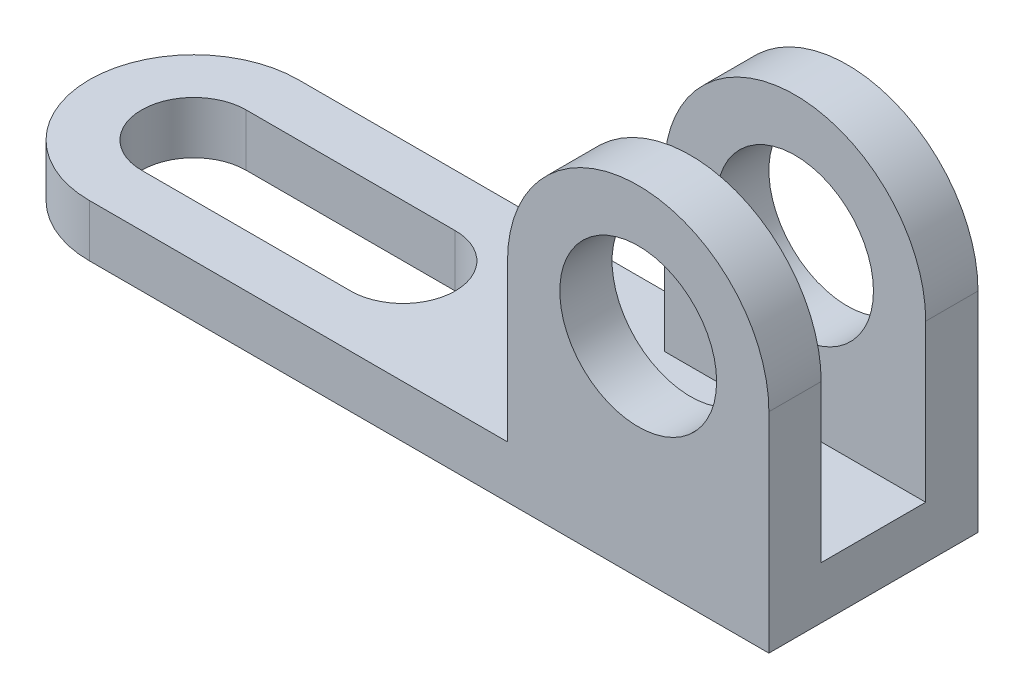
ISO-10303-21;
HEADER;
FILE_DESCRIPTION(('STEP AP214'),'2;1');
FILE_NAME('part.step','',(''),(''),'','','');
FILE_SCHEMA(('AUTOMOTIVE_DESIGN { 1 0 10303 214 1 1 1 1 }'));
ENDSEC;
DATA;
#1=APPLICATION_CONTEXT('core data for automotive mechanical design processes');
#2=APPLICATION_PROTOCOL_DEFINITION('international standard','automotive_design',2000,#1);
#3=PRODUCT_CONTEXT('',#1,'mechanical');
#4=PRODUCT('Part','Part','',(#3));
#5=PRODUCT_RELATED_PRODUCT_CATEGORY('part','',(#4));
#6=PRODUCT_DEFINITION_FORMATION('','',#4);
#7=PRODUCT_DEFINITION_CONTEXT('part definition',#1,'design');
#8=PRODUCT_DEFINITION('design','',#6,#7);
#9=PRODUCT_DEFINITION_SHAPE('','',#8);
#10=(LENGTH_UNIT() NAMED_UNIT(*) SI_UNIT(.MILLI.,.METRE.));
#11=(NAMED_UNIT(*) PLANE_ANGLE_UNIT() SI_UNIT($,.RADIAN.));
#12=(NAMED_UNIT(*) SI_UNIT($,.STERADIAN.) SOLID_ANGLE_UNIT());
#13=UNCERTAINTY_MEASURE_WITH_UNIT(LENGTH_MEASURE(1.E-05),#10,'distance_accuracy_value','');
#14=(GEOMETRIC_REPRESENTATION_CONTEXT(3) GLOBAL_UNCERTAINTY_ASSIGNED_CONTEXT((#13)) GLOBAL_UNIT_ASSIGNED_CONTEXT((#10,
#11,#12)) REPRESENTATION_CONTEXT('',''));
#15=CARTESIAN_POINT('',(0.,0.,0.));
#16=DIRECTION('',(0.,0.,1.));
#17=DIRECTION('',(1.,0.,0.));
#18=AXIS2_PLACEMENT_3D('',#15,#16,#17);
#19=CARTESIAN_POINT('',(-65.,5.,0.));
#20=DIRECTION('',(0.,1.,0.));
#21=DIRECTION('',(0.,0.,1.));
#22=AXIS2_PLACEMENT_3D('',#19,#20,#21);
#23=PLANE('',#22);
#24=DIRECTION('',(1.,0.,0.));
#25=VECTOR('',#24,1.);
#26=CARTESIAN_POINT('',(-65.,5.,10.));
#27=LINE('',#26,#25);
#28=CARTESIAN_POINT('',(-65.,5.,10.));
#29=VERTEX_POINT('',#28);
#30=CARTESIAN_POINT('',(-25.,5.,10.));
#31=VERTEX_POINT('',#30);
#32=EDGE_CURVE('E204',#29,#31,#27,.T.);
#33=ORIENTED_EDGE('',*,*,#32,.F.);
#34=CARTESIAN_POINT('',(-65.,5.,0.));
#35=DIRECTION('',(0.,1.,0.));
#36=DIRECTION('',(0.,0.,1.));
#37=AXIS2_PLACEMENT_3D('',#34,#35,#36);
#38=CIRCLE('',#37,10.);
#39=CARTESIAN_POINT('',(-65.,5.,-10.));
#40=VERTEX_POINT('',#39);
#41=EDGE_CURVE('E202',#40,#29,#38,.T.);
#42=ORIENTED_EDGE('',*,*,#41,.F.);
#43=DIRECTION('',(-1.,0.,0.));
#44=VECTOR('',#43,1.);
#45=CARTESIAN_POINT('',(-65.,5.,-10.));
#46=LINE('',#45,#44);
#47=CARTESIAN_POINT('',(-25.,5.,-10.));
#48=VERTEX_POINT('',#47);
#49=EDGE_CURVE('E210',#48,#40,#46,.T.);
#50=ORIENTED_EDGE('',*,*,#49,.F.);
#51=CARTESIAN_POINT('',(-25.,5.,0.));
#52=DIRECTION('',(0.,1.,0.));
#53=DIRECTION('',(0.,0.,1.));
#54=AXIS2_PLACEMENT_3D('',#51,#52,#53);
#55=CIRCLE('',#54,10.);
#56=EDGE_CURVE('E207',#31,#48,#55,.T.);
#57=ORIENTED_EDGE('',*,*,#56,.F.);
#58=EDGE_LOOP('',(#33,#42,#50,#57));
#59=FACE_BOUND('',#58,.T.);
#60=DIRECTION('',(0.,0.,-1.));
#61=VECTOR('',#60,1.);
#62=CARTESIAN_POINT('',(65.,5.,20.));
#63=LINE('',#62,#61);
#64=CARTESIAN_POINT('',(65.,5.,10.));
#65=VERTEX_POINT('',#64);
#66=CARTESIAN_POINT('',(65.,5.,-10.));
#67=VERTEX_POINT('',#66);
#68=EDGE_CURVE('E57',#65,#67,#63,.T.);
#69=ORIENTED_EDGE('',*,*,#68,.T.);
#70=DIRECTION('',(1.,0.,0.));
#71=VECTOR('',#70,1.);
#72=CARTESIAN_POINT('',(65.,5.,-10.));
#73=LINE('',#72,#71);
#74=CARTESIAN_POINT('',(15.,5.,-10.));
#75=VERTEX_POINT('',#74);
#76=EDGE_CURVE('E52',#75,#67,#73,.T.);
#77=ORIENTED_EDGE('',*,*,#76,.F.);
#78=DIRECTION('',(0.,0.,-1.));
#79=VECTOR('',#78,1.);
#80=CARTESIAN_POINT('',(15.,4.99999999999999,-10.));
#81=LINE('',#80,#79);
#82=CARTESIAN_POINT('',(15.,4.99999999999999,-20.));
#83=VERTEX_POINT('',#82);
#84=EDGE_CURVE('E149',#75,#83,#81,.T.);
#85=ORIENTED_EDGE('',*,*,#84,.T.);
#86=DIRECTION('',(-1.,0.,0.));
#87=VECTOR('',#86,1.);
#88=CARTESIAN_POINT('',(65.,5.,-20.));
#89=LINE('',#88,#87);
#90=CARTESIAN_POINT('',(-65.,5.,-20.));
#91=VERTEX_POINT('',#90);
#92=EDGE_CURVE('E241',#83,#91,#89,.T.);
#93=ORIENTED_EDGE('',*,*,#92,.T.);
#94=CARTESIAN_POINT('',(-65.,5.,0.));
#95=DIRECTION('',(0.,1.,0.));
#96=DIRECTION('',(0.,0.,1.));
#97=AXIS2_PLACEMENT_3D('',#94,#95,#96);
#98=CIRCLE('',#97,20.);
#99=CARTESIAN_POINT('',(-65.,5.,20.));
#100=VERTEX_POINT('',#99);
#101=EDGE_CURVE('E233',#91,#100,#98,.T.);
#102=ORIENTED_EDGE('',*,*,#101,.T.);
#103=DIRECTION('',(1.,0.,0.));
#104=VECTOR('',#103,1.);
#105=CARTESIAN_POINT('',(65.,5.,20.));
#106=LINE('',#105,#104);
#107=CARTESIAN_POINT('',(15.,4.99999999999999,20.));
#108=VERTEX_POINT('',#107);
#109=EDGE_CURVE('E236',#100,#108,#106,.T.);
#110=ORIENTED_EDGE('',*,*,#109,.T.);
#111=DIRECTION('',(0.,0.,1.));
#112=VECTOR('',#111,1.);
#113=CARTESIAN_POINT('',(15.,4.99999999999999,10.));
#114=LINE('',#113,#112);
#115=CARTESIAN_POINT('',(15.,4.99999999999999,10.));
#116=VERTEX_POINT('',#115);
#117=EDGE_CURVE('E195',#116,#108,#114,.T.);
#118=ORIENTED_EDGE('',*,*,#117,.F.);
#119=DIRECTION('',(1.,0.,0.));
#120=VECTOR('',#119,1.);
#121=CARTESIAN_POINT('',(65.,5.,10.));
#122=LINE('',#121,#120);
#123=EDGE_CURVE('E188',#116,#65,#122,.T.);
#124=ORIENTED_EDGE('',*,*,#123,.T.);
#125=EDGE_LOOP('',(#69,#77,#85,#93,#102,#110,#118,#124));
#126=FACE_BOUND('',#125,.T.);
#127=ADVANCED_FACE('F37',(#59,#126),#23,.T.);
#128=CARTESIAN_POINT('',(-65.,-5.,0.));
#129=DIRECTION('',(0.,1.,0.));
#130=DIRECTION('',(0.,0.,1.));
#131=AXIS2_PLACEMENT_3D('',#128,#129,#130);
#132=PLANE('',#131);
#133=CARTESIAN_POINT('',(-65.,-5.,0.));
#134=DIRECTION('',(0.,1.,0.));
#135=DIRECTION('',(0.,0.,1.));
#136=AXIS2_PLACEMENT_3D('',#133,#134,#135);
#137=CIRCLE('',#136,20.);
#138=CARTESIAN_POINT('',(-65.,-5.,-20.));
#139=VERTEX_POINT('',#138);
#140=CARTESIAN_POINT('',(-65.,-5.,20.));
#141=VERTEX_POINT('',#140);
#142=EDGE_CURVE('E232',#139,#141,#137,.T.);
#143=ORIENTED_EDGE('',*,*,#142,.F.);
#144=DIRECTION('',(-1.,0.,0.));
#145=VECTOR('',#144,1.);
#146=CARTESIAN_POINT('',(65.,-5.,-20.));
#147=LINE('',#146,#145);
#148=CARTESIAN_POINT('',(65.,-5.,-20.));
#149=VERTEX_POINT('',#148);
#150=EDGE_CURVE('E237',#149,#139,#147,.T.);
#151=ORIENTED_EDGE('',*,*,#150,.F.);
#152=DIRECTION('',(0.,0.,-1.));
#153=VECTOR('',#152,1.);
#154=CARTESIAN_POINT('',(65.,-5.,20.));
#155=LINE('',#154,#153);
#156=CARTESIAN_POINT('',(65.,-5.,20.));
#157=VERTEX_POINT('',#156);
#158=EDGE_CURVE('E249',#157,#149,#155,.T.);
#159=ORIENTED_EDGE('',*,*,#158,.F.);
#160=DIRECTION('',(1.,0.,0.));
#161=VECTOR('',#160,1.);
#162=CARTESIAN_POINT('',(65.,-5.,20.));
#163=LINE('',#162,#161);
#164=EDGE_CURVE('E246',#141,#157,#163,.T.);
#165=ORIENTED_EDGE('',*,*,#164,.F.);
#166=EDGE_LOOP('',(#143,#151,#159,#165));
#167=FACE_BOUND('',#166,.T.);
#168=CARTESIAN_POINT('',(-65.,-5.,0.));
#169=DIRECTION('',(0.,1.,0.));
#170=DIRECTION('',(0.,0.,1.));
#171=AXIS2_PLACEMENT_3D('',#168,#169,#170);
#172=CIRCLE('',#171,10.);
#173=CARTESIAN_POINT('',(-65.,-5.,-10.));
#174=VERTEX_POINT('',#173);
#175=CARTESIAN_POINT('',(-65.,-5.,10.));
#176=VERTEX_POINT('',#175);
#177=EDGE_CURVE('E197',#174,#176,#172,.T.);
#178=ORIENTED_EDGE('',*,*,#177,.T.);
#179=DIRECTION('',(1.,0.,0.));
#180=VECTOR('',#179,1.);
#181=CARTESIAN_POINT('',(-65.,-5.,10.));
#182=LINE('',#181,#180);
#183=CARTESIAN_POINT('',(-25.,-5.,10.));
#184=VERTEX_POINT('',#183);
#185=EDGE_CURVE('E215',#176,#184,#182,.T.);
#186=ORIENTED_EDGE('',*,*,#185,.T.);
#187=CARTESIAN_POINT('',(-25.,-5.,0.));
#188=DIRECTION('',(0.,1.,0.));
#189=DIRECTION('',(0.,0.,1.));
#190=AXIS2_PLACEMENT_3D('',#187,#188,#189);
#191=CIRCLE('',#190,10.);
#192=CARTESIAN_POINT('',(-25.,-5.,-10.));
#193=VERTEX_POINT('',#192);
#194=EDGE_CURVE('E218',#184,#193,#191,.T.);
#195=ORIENTED_EDGE('',*,*,#194,.T.);
#196=DIRECTION('',(-1.,0.,0.));
#197=VECTOR('',#196,1.);
#198=CARTESIAN_POINT('',(-65.,-5.,-10.));
#199=LINE('',#198,#197);
#200=EDGE_CURVE('E205',#193,#174,#199,.T.);
#201=ORIENTED_EDGE('',*,*,#200,.T.);
#202=EDGE_LOOP('',(#178,#186,#195,#201));
#203=FACE_BOUND('',#202,.T.);
#204=ADVANCED_FACE('F267',(#167,#203),#132,.F.);
#205=CARTESIAN_POINT('',(-65.,5.,0.));
#206=DIRECTION('',(0.,-1.,0.));
#207=DIRECTION('',(0.,0.,-1.));
#208=AXIS2_PLACEMENT_3D('',#205,#206,#207);
#209=CYLINDRICAL_SURFACE('',#208,20.);
#210=ORIENTED_EDGE('',*,*,#142,.T.);
#211=DIRECTION('',(0.,-1.,0.));
#212=VECTOR('',#211,1.);
#213=CARTESIAN_POINT('',(-65.,5.,20.));
#214=LINE('',#213,#212);
#215=EDGE_CURVE('E11',#100,#141,#214,.T.);
#216=ORIENTED_EDGE('',*,*,#215,.F.);
#217=ORIENTED_EDGE('',*,*,#101,.F.);
#218=DIRECTION('',(0.,-1.,0.));
#219=VECTOR('',#218,1.);
#220=CARTESIAN_POINT('',(-65.,5.,-20.));
#221=LINE('',#220,#219);
#222=EDGE_CURVE('E243',#91,#139,#221,.T.);
#223=ORIENTED_EDGE('',*,*,#222,.T.);
#224=EDGE_LOOP('',(#210,#216,#217,#223));
#225=FACE_BOUND('',#224,.T.);
#226=ADVANCED_FACE('F39',(#225),#209,.T.);
#227=CARTESIAN_POINT('',(65.,5.,20.));
#228=DIRECTION('',(0.,0.,-1.));
#229=DIRECTION('',(-1.,0.,0.));
#230=AXIS2_PLACEMENT_3D('',#227,#228,#229);
#231=PLANE('',#230);
#232=DIRECTION('',(0.,-1.,0.));
#233=VECTOR('',#232,1.);
#234=CARTESIAN_POINT('',(15.,4.99999999999999,20.));
#235=LINE('',#234,#233);
#236=CARTESIAN_POINT('',(15.,35.,20.));
#237=VERTEX_POINT('',#236);
#238=EDGE_CURVE('E183',#237,#108,#235,.T.);
#239=ORIENTED_EDGE('',*,*,#238,.T.);
#240=ORIENTED_EDGE('',*,*,#109,.F.);
#241=ORIENTED_EDGE('',*,*,#215,.T.);
#242=ORIENTED_EDGE('',*,*,#164,.T.);
#243=DIRECTION('',(0.,-1.,0.));
#244=VECTOR('',#243,1.);
#245=CARTESIAN_POINT('',(65.,5.,20.));
#246=LINE('',#245,#244);
#247=CARTESIAN_POINT('',(65.,35.,20.));
#248=VERTEX_POINT('',#247);
#249=EDGE_CURVE('E45',#248,#157,#246,.T.);
#250=ORIENTED_EDGE('',*,*,#249,.F.);
#251=CARTESIAN_POINT('',(40.,35.,20.));
#252=DIRECTION('',(0.,0.,1.));
#253=DIRECTION('',(1.,0.,0.));
#254=AXIS2_PLACEMENT_3D('',#251,#252,#253);
#255=CIRCLE('',#254,25.);
#256=EDGE_CURVE('E176',#248,#237,#255,.T.);
#257=ORIENTED_EDGE('',*,*,#256,.T.);
#258=EDGE_LOOP('',(#239,#240,#241,#242,#250,#257));
#259=FACE_BOUND('',#258,.T.);
#260=CARTESIAN_POINT('',(40.,35.,20.));
#261=DIRECTION('',(0.,0.,1.));
#262=DIRECTION('',(1.,0.,0.));
#263=AXIS2_PLACEMENT_3D('',#260,#261,#262);
#264=CIRCLE('',#263,15.);
#265=CARTESIAN_POINT('',(55.,35.,20.));
#266=VERTEX_POINT('',#265);
#267=EDGE_CURVE('E170',#266,#266,#264,.T.);
#268=ORIENTED_EDGE('',*,*,#267,.F.);
#269=EDGE_LOOP('',(#268));
#270=FACE_BOUND('',#269,.T.);
#271=ADVANCED_FACE('F261',(#259,#270),#231,.F.);
#272=CARTESIAN_POINT('',(65.,5.,20.));
#273=DIRECTION('',(-1.,0.,0.));
#274=DIRECTION('',(0.,0.,1.));
#275=AXIS2_PLACEMENT_3D('',#272,#273,#274);
#276=PLANE('',#275);
#277=ORIENTED_EDGE('',*,*,#249,.T.);
#278=ORIENTED_EDGE('',*,*,#158,.T.);
#279=DIRECTION('',(0.,-1.,0.));
#280=VECTOR('',#279,1.);
#281=CARTESIAN_POINT('',(65.,5.,-20.));
#282=LINE('',#281,#280);
#283=CARTESIAN_POINT('',(65.,35.,-20.));
#284=VERTEX_POINT('',#283);
#285=EDGE_CURVE('E254',#284,#149,#282,.T.);
#286=ORIENTED_EDGE('',*,*,#285,.F.);
#287=DIRECTION('',(0.,0.,-1.));
#288=VECTOR('',#287,1.);
#289=CARTESIAN_POINT('',(65.,35.,-10.));
#290=LINE('',#289,#288);
#291=CARTESIAN_POINT('',(65.,35.,-10.));
#292=VERTEX_POINT('',#291);
#293=EDGE_CURVE('E159',#292,#284,#290,.T.);
#294=ORIENTED_EDGE('',*,*,#293,.F.);
#295=DIRECTION('',(0.,1.,0.));
#296=VECTOR('',#295,1.);
#297=CARTESIAN_POINT('',(65.,5.,-10.));
#298=LINE('',#297,#296);
#299=EDGE_CURVE('E145',#67,#292,#298,.T.);
#300=ORIENTED_EDGE('',*,*,#299,.F.);
#301=ORIENTED_EDGE('',*,*,#68,.F.);
#302=DIRECTION('',(0.,1.,0.));
#303=VECTOR('',#302,1.);
#304=CARTESIAN_POINT('',(65.,5.,10.));
#305=LINE('',#304,#303);
#306=CARTESIAN_POINT('',(65.,35.,10.));
#307=VERTEX_POINT('',#306);
#308=EDGE_CURVE('E179',#65,#307,#305,.T.);
#309=ORIENTED_EDGE('',*,*,#308,.T.);
#310=DIRECTION('',(0.,0.,1.));
#311=VECTOR('',#310,1.);
#312=CARTESIAN_POINT('',(65.,35.,10.));
#313=LINE('',#312,#311);
#314=EDGE_CURVE('E190',#307,#248,#313,.T.);
#315=ORIENTED_EDGE('',*,*,#314,.T.);
#316=EDGE_LOOP('',(#277,#278,#286,#294,#300,#301,#309,#315));
#317=FACE_BOUND('',#316,.T.);
#318=ADVANCED_FACE('F257',(#317),#276,.F.);
#319=CARTESIAN_POINT('',(65.,5.,-20.));
#320=DIRECTION('',(0.,0.,1.));
#321=DIRECTION('',(1.,0.,0.));
#322=AXIS2_PLACEMENT_3D('',#319,#320,#321);
#323=PLANE('',#322);
#324=ORIENTED_EDGE('',*,*,#150,.T.);
#325=ORIENTED_EDGE('',*,*,#222,.F.);
#326=ORIENTED_EDGE('',*,*,#92,.F.);
#327=DIRECTION('',(0.,-1.,0.));
#328=VECTOR('',#327,1.);
#329=CARTESIAN_POINT('',(15.,4.99999999999999,-20.));
#330=LINE('',#329,#328);
#331=CARTESIAN_POINT('',(15.,35.,-20.));
#332=VERTEX_POINT('',#331);
#333=EDGE_CURVE('E166',#332,#83,#330,.T.);
#334=ORIENTED_EDGE('',*,*,#333,.F.);
#335=CARTESIAN_POINT('',(40.,35.,-20.));
#336=DIRECTION('',(0.,0.,1.));
#337=DIRECTION('',(1.,0.,0.));
#338=AXIS2_PLACEMENT_3D('',#335,#336,#337);
#339=CIRCLE('',#338,25.);
#340=EDGE_CURVE('E155',#284,#332,#339,.T.);
#341=ORIENTED_EDGE('',*,*,#340,.F.);
#342=ORIENTED_EDGE('',*,*,#285,.T.);
#343=EDGE_LOOP('',(#324,#325,#326,#334,#341,#342));
#344=FACE_BOUND('',#343,.T.);
#345=CARTESIAN_POINT('',(40.,35.,-20.));
#346=DIRECTION('',(0.,0.,1.));
#347=DIRECTION('',(1.,0.,0.));
#348=AXIS2_PLACEMENT_3D('',#345,#346,#347);
#349=CIRCLE('',#348,15.);
#350=CARTESIAN_POINT('',(55.,35.,-20.));
#351=VERTEX_POINT('',#350);
#352=EDGE_CURVE('E277',#351,#351,#349,.T.);
#353=ORIENTED_EDGE('',*,*,#352,.T.);
#354=EDGE_LOOP('',(#353));
#355=FACE_BOUND('',#354,.T.);
#356=ADVANCED_FACE('F271',(#344,#355),#323,.F.);
#357=CARTESIAN_POINT('',(-65.,5.,0.));
#358=DIRECTION('',(0.,-1.,0.));
#359=DIRECTION('',(0.,0.,-1.));
#360=AXIS2_PLACEMENT_3D('',#357,#358,#359);
#361=CYLINDRICAL_SURFACE('',#360,10.);
#362=ORIENTED_EDGE('',*,*,#177,.F.);
#363=DIRECTION('',(0.,-1.,0.));
#364=VECTOR('',#363,1.);
#365=CARTESIAN_POINT('',(-65.,5.,-10.));
#366=LINE('',#365,#364);
#367=EDGE_CURVE('E212',#40,#174,#366,.T.);
#368=ORIENTED_EDGE('',*,*,#367,.F.);
#369=ORIENTED_EDGE('',*,*,#41,.T.);
#370=DIRECTION('',(0.,-1.,0.));
#371=VECTOR('',#370,1.);
#372=CARTESIAN_POINT('',(-65.,5.,10.));
#373=LINE('',#372,#371);
#374=EDGE_CURVE('E229',#29,#176,#373,.T.);
#375=ORIENTED_EDGE('',*,*,#374,.T.);
#376=EDGE_LOOP('',(#362,#368,#369,#375));
#377=FACE_BOUND('',#376,.T.);
#378=ADVANCED_FACE('F306',(#377),#361,.F.);
#379=CARTESIAN_POINT('',(-65.,5.,10.));
#380=DIRECTION('',(0.,0.,-1.));
#381=DIRECTION('',(-1.,0.,0.));
#382=AXIS2_PLACEMENT_3D('',#379,#380,#381);
#383=PLANE('',#382);
#384=ORIENTED_EDGE('',*,*,#185,.F.);
#385=ORIENTED_EDGE('',*,*,#374,.F.);
#386=ORIENTED_EDGE('',*,*,#32,.T.);
#387=DIRECTION('',(0.,-1.,0.));
#388=VECTOR('',#387,1.);
#389=CARTESIAN_POINT('',(-25.,5.,10.));
#390=LINE('',#389,#388);
#391=EDGE_CURVE('E227',#31,#184,#390,.T.);
#392=ORIENTED_EDGE('',*,*,#391,.T.);
#393=EDGE_LOOP('',(#384,#385,#386,#392));
#394=FACE_BOUND('',#393,.T.);
#395=ADVANCED_FACE('F368',(#394),#383,.T.);
#396=CARTESIAN_POINT('',(-25.,5.,0.));
#397=DIRECTION('',(0.,-1.,0.));
#398=DIRECTION('',(0.,0.,-1.));
#399=AXIS2_PLACEMENT_3D('',#396,#397,#398);
#400=CYLINDRICAL_SURFACE('',#399,10.);
#401=ORIENTED_EDGE('',*,*,#194,.F.);
#402=ORIENTED_EDGE('',*,*,#391,.F.);
#403=ORIENTED_EDGE('',*,*,#56,.T.);
#404=DIRECTION('',(0.,-1.,0.));
#405=VECTOR('',#404,1.);
#406=CARTESIAN_POINT('',(-25.,5.,-10.));
#407=LINE('',#406,#405);
#408=EDGE_CURVE('E225',#48,#193,#407,.T.);
#409=ORIENTED_EDGE('',*,*,#408,.T.);
#410=EDGE_LOOP('',(#401,#402,#403,#409));
#411=FACE_BOUND('',#410,.T.);
#412=ADVANCED_FACE('F378',(#411),#400,.F.);
#413=CARTESIAN_POINT('',(-65.,5.,-10.));
#414=DIRECTION('',(0.,0.,1.));
#415=DIRECTION('',(1.,0.,0.));
#416=AXIS2_PLACEMENT_3D('',#413,#414,#415);
#417=PLANE('',#416);
#418=ORIENTED_EDGE('',*,*,#200,.F.);
#419=ORIENTED_EDGE('',*,*,#408,.F.);
#420=ORIENTED_EDGE('',*,*,#49,.T.);
#421=ORIENTED_EDGE('',*,*,#367,.T.);
#422=EDGE_LOOP('',(#418,#419,#420,#421));
#423=FACE_BOUND('',#422,.T.);
#424=ADVANCED_FACE('F387',(#423),#417,.T.);
#425=CARTESIAN_POINT('',(15.,4.99999999999999,10.));
#426=DIRECTION('',(-1.,0.,0.));
#427=DIRECTION('',(0.,0.,1.));
#428=AXIS2_PLACEMENT_3D('',#425,#426,#427);
#429=PLANE('',#428);
#430=ORIENTED_EDGE('',*,*,#238,.F.);
#431=DIRECTION('',(0.,0.,1.));
#432=VECTOR('',#431,1.);
#433=CARTESIAN_POINT('',(15.,35.,10.));
#434=LINE('',#433,#432);
#435=CARTESIAN_POINT('',(15.,35.,10.));
#436=VERTEX_POINT('',#435);
#437=EDGE_CURVE('E198',#436,#237,#434,.T.);
#438=ORIENTED_EDGE('',*,*,#437,.F.);
#439=DIRECTION('',(0.,-1.,0.));
#440=VECTOR('',#439,1.);
#441=CARTESIAN_POINT('',(15.,4.99999999999999,10.));
#442=LINE('',#441,#440);
#443=EDGE_CURVE('E186',#436,#116,#442,.T.);
#444=ORIENTED_EDGE('',*,*,#443,.T.);
#445=ORIENTED_EDGE('',*,*,#117,.T.);
#446=EDGE_LOOP('',(#430,#438,#444,#445));
#447=FACE_BOUND('',#446,.T.);
#448=ADVANCED_FACE('F397',(#447),#429,.T.);
#449=CARTESIAN_POINT('',(40.,35.,10.));
#450=DIRECTION('',(0.,0.,1.));
#451=DIRECTION('',(1.,0.,0.));
#452=AXIS2_PLACEMENT_3D('',#449,#450,#451);
#453=CYLINDRICAL_SURFACE('',#452,25.);
#454=ORIENTED_EDGE('',*,*,#256,.F.);
#455=ORIENTED_EDGE('',*,*,#314,.F.);
#456=CARTESIAN_POINT('',(40.,35.,10.));
#457=DIRECTION('',(0.,0.,1.));
#458=DIRECTION('',(1.,0.,0.));
#459=AXIS2_PLACEMENT_3D('',#456,#457,#458);
#460=CIRCLE('',#459,25.);
#461=EDGE_CURVE('E182',#307,#436,#460,.T.);
#462=ORIENTED_EDGE('',*,*,#461,.T.);
#463=ORIENTED_EDGE('',*,*,#437,.T.);
#464=EDGE_LOOP('',(#454,#455,#462,#463));
#465=FACE_BOUND('',#464,.T.);
#466=ADVANCED_FACE('F408',(#465),#453,.T.);
#467=CARTESIAN_POINT('',(40.,35.,10.));
#468=DIRECTION('',(0.,0.,1.));
#469=DIRECTION('',(1.,0.,0.));
#470=AXIS2_PLACEMENT_3D('',#467,#468,#469);
#471=PLANE('',#470);
#472=CARTESIAN_POINT('',(40.,35.,10.));
#473=DIRECTION('',(0.,0.,1.));
#474=DIRECTION('',(1.,0.,0.));
#475=AXIS2_PLACEMENT_3D('',#472,#473,#474);
#476=CIRCLE('',#475,15.);
#477=CARTESIAN_POINT('',(55.,35.,10.));
#478=VERTEX_POINT('',#477);
#479=EDGE_CURVE('E173',#478,#478,#476,.T.);
#480=ORIENTED_EDGE('',*,*,#479,.T.);
#481=EDGE_LOOP('',(#480));
#482=FACE_BOUND('',#481,.T.);
#483=ORIENTED_EDGE('',*,*,#308,.F.);
#484=ORIENTED_EDGE('',*,*,#123,.F.);
#485=ORIENTED_EDGE('',*,*,#443,.F.);
#486=ORIENTED_EDGE('',*,*,#461,.F.);
#487=EDGE_LOOP('',(#483,#484,#485,#486));
#488=FACE_BOUND('',#487,.T.);
#489=ADVANCED_FACE('F293',(#482,#488),#471,.F.);
#490=CARTESIAN_POINT('',(40.,35.,10.));
#491=DIRECTION('',(0.,0.,1.));
#492=DIRECTION('',(1.,0.,0.));
#493=AXIS2_PLACEMENT_3D('',#490,#491,#492);
#494=CYLINDRICAL_SURFACE('',#493,15.);
#495=ORIENTED_EDGE('',*,*,#479,.F.);
#496=EDGE_LOOP('',(#495));
#497=FACE_BOUND('',#496,.T.);
#498=ORIENTED_EDGE('',*,*,#267,.T.);
#499=EDGE_LOOP('',(#498));
#500=FACE_BOUND('',#499,.T.);
#501=ADVANCED_FACE('F286',(#497,#500),#494,.F.);
#502=CARTESIAN_POINT('',(40.,35.,-10.));
#503=DIRECTION('',(0.,0.,-1.));
#504=DIRECTION('',(1.,0.,0.));
#505=AXIS2_PLACEMENT_3D('',#502,#503,#504);
#506=PLANE('',#505);
#507=ORIENTED_EDGE('',*,*,#299,.T.);
#508=CARTESIAN_POINT('',(40.,35.,-10.));
#509=DIRECTION('',(0.,0.,1.));
#510=DIRECTION('',(1.,0.,0.));
#511=AXIS2_PLACEMENT_3D('',#508,#509,#510);
#512=CIRCLE('',#511,25.);
#513=CARTESIAN_POINT('',(15.,35.,-10.));
#514=VERTEX_POINT('',#513);
#515=EDGE_CURVE('E137',#292,#514,#512,.T.);
#516=ORIENTED_EDGE('',*,*,#515,.T.);
#517=DIRECTION('',(0.,-1.,0.));
#518=VECTOR('',#517,1.);
#519=CARTESIAN_POINT('',(15.,4.99999999999999,-10.));
#520=LINE('',#519,#518);
#521=EDGE_CURVE('E142',#514,#75,#520,.T.);
#522=ORIENTED_EDGE('',*,*,#521,.T.);
#523=ORIENTED_EDGE('',*,*,#76,.T.);
#524=EDGE_LOOP('',(#507,#516,#522,#523));
#525=FACE_BOUND('',#524,.T.);
#526=CARTESIAN_POINT('',(40.,35.,-10.));
#527=DIRECTION('',(0.,0.,1.));
#528=DIRECTION('',(1.,0.,0.));
#529=AXIS2_PLACEMENT_3D('',#526,#527,#528);
#530=CIRCLE('',#529,15.);
#531=CARTESIAN_POINT('',(55.,35.,-10.));
#532=VERTEX_POINT('',#531);
#533=EDGE_CURVE('E168',#532,#532,#530,.T.);
#534=ORIENTED_EDGE('',*,*,#533,.F.);
#535=EDGE_LOOP('',(#534));
#536=FACE_BOUND('',#535,.T.);
#537=ADVANCED_FACE('F139',(#525,#536),#506,.F.);
#538=CARTESIAN_POINT('',(40.,35.,-10.));
#539=DIRECTION('',(0.,0.,-1.));
#540=DIRECTION('',(-1.,0.,0.));
#541=AXIS2_PLACEMENT_3D('',#538,#539,#540);
#542=CYLINDRICAL_SURFACE('',#541,25.);
#543=ORIENTED_EDGE('',*,*,#340,.T.);
#544=DIRECTION('',(0.,0.,-1.));
#545=VECTOR('',#544,1.);
#546=CARTESIAN_POINT('',(15.,35.,-10.));
#547=LINE('',#546,#545);
#548=EDGE_CURVE('E152',#514,#332,#547,.T.);
#549=ORIENTED_EDGE('',*,*,#548,.F.);
#550=ORIENTED_EDGE('',*,*,#515,.F.);
#551=ORIENTED_EDGE('',*,*,#293,.T.);
#552=EDGE_LOOP('',(#543,#549,#550,#551));
#553=FACE_BOUND('',#552,.T.);
#554=ADVANCED_FACE('F153',(#553),#542,.T.);
#555=CARTESIAN_POINT('',(15.,4.99999999999999,-10.));
#556=DIRECTION('',(1.,0.,0.));
#557=DIRECTION('',(0.,0.,-1.));
#558=AXIS2_PLACEMENT_3D('',#555,#556,#557);
#559=PLANE('',#558);
#560=ORIENTED_EDGE('',*,*,#333,.T.);
#561=ORIENTED_EDGE('',*,*,#84,.F.);
#562=ORIENTED_EDGE('',*,*,#521,.F.);
#563=ORIENTED_EDGE('',*,*,#548,.T.);
#564=EDGE_LOOP('',(#560,#561,#562,#563));
#565=FACE_BOUND('',#564,.T.);
#566=ADVANCED_FACE('F161',(#565),#559,.F.);
#567=CARTESIAN_POINT('',(40.,35.,-10.));
#568=DIRECTION('',(0.,0.,-1.));
#569=DIRECTION('',(-1.,0.,0.));
#570=AXIS2_PLACEMENT_3D('',#567,#568,#569);
#571=CYLINDRICAL_SURFACE('',#570,15.);
#572=ORIENTED_EDGE('',*,*,#533,.T.);
#573=EDGE_LOOP('',(#572));
#574=FACE_BOUND('',#573,.T.);
#575=ORIENTED_EDGE('',*,*,#352,.F.);
#576=EDGE_LOOP('',(#575));
#577=FACE_BOUND('',#576,.T.);
#578=ADVANCED_FACE('F283',(#574,#577),#571,.F.);
#579=CLOSED_SHELL('',(#127,#204,#226,#271,#318,#356,#378,#395,#412,#424,#448,#466,#489,#501,
#537,#554,#566,#578));
#580=MANIFOLD_SOLID_BREP('B2',#579);
#581=ADVANCED_BREP_SHAPE_REPRESENTATION('',(#18,#580),#14);
#582=SHAPE_DEFINITION_REPRESENTATION(#9,#581);
ENDSEC;
END-ISO-10303-21;
